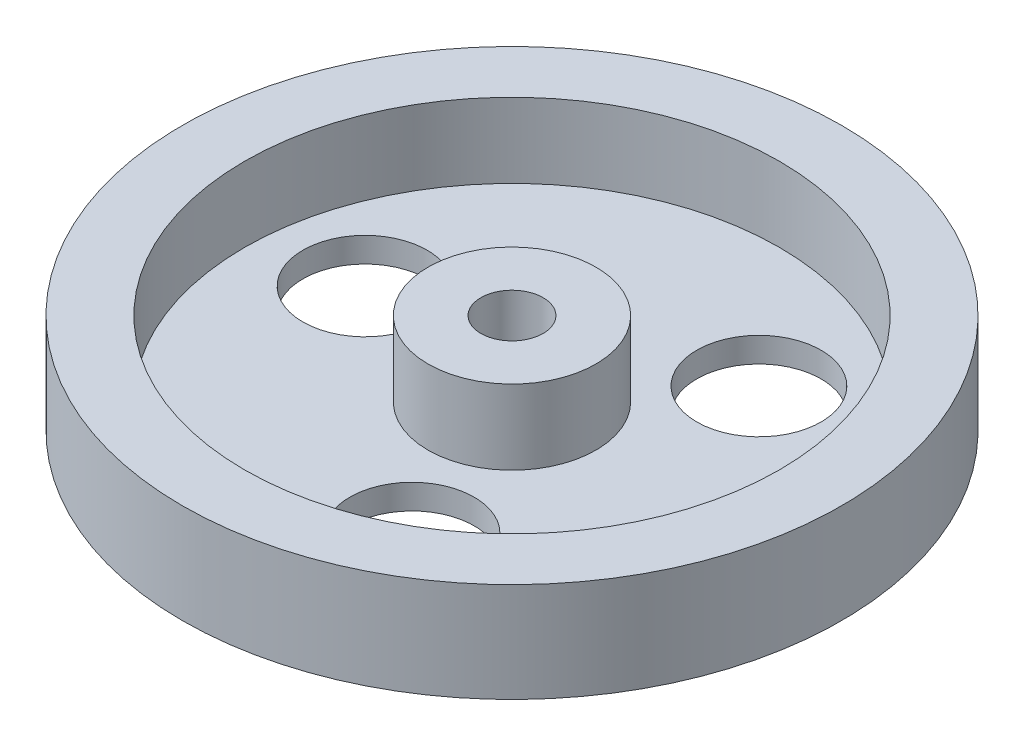
ISO-10303-21;
HEADER;
FILE_DESCRIPTION(('STEP AP214'),'2;1');
FILE_NAME('part.step','',(''),(''),'','','');
FILE_SCHEMA(('AUTOMOTIVE_DESIGN { 1 0 10303 214 1 1 1 1 }'));
ENDSEC;
DATA;
#1=APPLICATION_CONTEXT('core data for automotive mechanical design processes');
#2=APPLICATION_PROTOCOL_DEFINITION('international standard','automotive_design',2000,#1);
#3=PRODUCT_CONTEXT('',#1,'mechanical');
#4=PRODUCT('Part','Part','',(#3));
#5=PRODUCT_RELATED_PRODUCT_CATEGORY('part','',(#4));
#6=PRODUCT_DEFINITION_FORMATION('','',#4);
#7=PRODUCT_DEFINITION_CONTEXT('part definition',#1,'design');
#8=PRODUCT_DEFINITION('design','',#6,#7);
#9=PRODUCT_DEFINITION_SHAPE('','',#8);
#10=(LENGTH_UNIT() NAMED_UNIT(*) SI_UNIT(.MILLI.,.METRE.));
#11=(NAMED_UNIT(*) PLANE_ANGLE_UNIT() SI_UNIT($,.RADIAN.));
#12=(NAMED_UNIT(*) SI_UNIT($,.STERADIAN.) SOLID_ANGLE_UNIT());
#13=UNCERTAINTY_MEASURE_WITH_UNIT(LENGTH_MEASURE(1.E-05),#10,'distance_accuracy_value','');
#14=(GEOMETRIC_REPRESENTATION_CONTEXT(3) GLOBAL_UNCERTAINTY_ASSIGNED_CONTEXT((#13)) GLOBAL_UNIT_ASSIGNED_CONTEXT((#10,
#11,#12)) REPRESENTATION_CONTEXT('',''));
#15=CARTESIAN_POINT('',(0.,0.,0.));
#16=DIRECTION('',(0.,0.,1.));
#17=DIRECTION('',(1.,0.,0.));
#18=AXIS2_PLACEMENT_3D('',#15,#16,#17);
#19=CARTESIAN_POINT('',(0.,8.,0.));
#20=DIRECTION('',(0.,-1.,0.));
#21=DIRECTION('',(0.,0.,-1.));
#22=AXIS2_PLACEMENT_3D('',#19,#20,#21);
#23=CYLINDRICAL_SURFACE('',#22,26.5);
#24=CARTESIAN_POINT('',(0.,8.,0.));
#25=DIRECTION('',(0.,1.,0.));
#26=DIRECTION('',(0.,0.,1.));
#27=AXIS2_PLACEMENT_3D('',#24,#25,#26);
#28=CIRCLE('',#27,26.5);
#29=CARTESIAN_POINT('',(0.,8.,26.5));
#30=VERTEX_POINT('',#29);
#31=EDGE_CURVE('E10',#30,#30,#28,.T.);
#32=ORIENTED_EDGE('',*,*,#31,.F.);
#33=EDGE_LOOP('',(#32));
#34=FACE_BOUND('',#33,.T.);
#35=CARTESIAN_POINT('',(0.,0.,0.));
#36=DIRECTION('',(0.,1.,0.));
#37=DIRECTION('',(0.,0.,1.));
#38=AXIS2_PLACEMENT_3D('',#35,#36,#37);
#39=CIRCLE('',#38,26.5);
#40=CARTESIAN_POINT('',(0.,0.,26.5));
#41=VERTEX_POINT('',#40);
#42=EDGE_CURVE('E35',#41,#41,#39,.T.);
#43=ORIENTED_EDGE('',*,*,#42,.T.);
#44=EDGE_LOOP('',(#43));
#45=FACE_BOUND('',#44,.T.);
#46=ADVANCED_FACE('F32',(#34,#45),#23,.T.);
#47=CARTESIAN_POINT('',(0.,8.,0.));
#48=DIRECTION('',(0.,1.,0.));
#49=DIRECTION('',(0.,0.,1.));
#50=AXIS2_PLACEMENT_3D('',#47,#48,#49);
#51=PLANE('',#50);
#52=CARTESIAN_POINT('',(0.,8.,0.));
#53=DIRECTION('',(0.,1.,0.));
#54=DIRECTION('',(0.,0.,1.));
#55=AXIS2_PLACEMENT_3D('',#52,#53,#54);
#56=CIRCLE('',#55,21.5);
#57=CARTESIAN_POINT('',(0.,8.,21.5));
#58=VERTEX_POINT('',#57);
#59=EDGE_CURVE('E44',#58,#58,#56,.T.);
#60=ORIENTED_EDGE('',*,*,#59,.F.);
#61=EDGE_LOOP('',(#60));
#62=FACE_BOUND('',#61,.T.);
#63=ORIENTED_EDGE('',*,*,#31,.T.);
#64=EDGE_LOOP('',(#63));
#65=FACE_BOUND('',#64,.T.);
#66=ADVANCED_FACE('F109',(#62,#65),#51,.T.);
#67=CARTESIAN_POINT('',(0.,0.,0.));
#68=DIRECTION('',(0.,1.,0.));
#69=DIRECTION('',(0.,0.,1.));
#70=AXIS2_PLACEMENT_3D('',#67,#68,#69);
#71=PLANE('',#70);
#72=CARTESIAN_POINT('',(8.83815804580016,0.,-11.0182842292917));
#73=DIRECTION('',(0.,1.,0.));
#74=DIRECTION('',(0.,0.,1.));
#75=AXIS2_PLACEMENT_3D('',#72,#73,#74);
#76=CIRCLE('',#75,5.);
#77=CARTESIAN_POINT('',(8.83815804580016,0.,-6.01828422929168));
#78=VERTEX_POINT('',#77);
#79=EDGE_CURVE('E71',#78,#78,#76,.T.);
#80=ORIENTED_EDGE('',*,*,#79,.T.);
#81=EDGE_LOOP('',(#80));
#82=FACE_BOUND('',#81,.T.);
#83=CARTESIAN_POINT('',(5.12303502578391,0.,13.1632115049706));
#84=DIRECTION('',(0.,1.,0.));
#85=DIRECTION('',(0.,0.,1.));
#86=AXIS2_PLACEMENT_3D('',#83,#84,#85);
#87=CIRCLE('',#86,5.);
#88=CARTESIAN_POINT('',(5.12303502578391,0.,18.1632115049706));
#89=VERTEX_POINT('',#88);
#90=EDGE_CURVE('E65',#89,#89,#87,.T.);
#91=ORIENTED_EDGE('',*,*,#90,.T.);
#92=EDGE_LOOP('',(#91));
#93=FACE_BOUND('',#92,.T.);
#94=CARTESIAN_POINT('',(-13.9611930715841,0.,-2.14492727567885));
#95=DIRECTION('',(0.,1.,0.));
#96=DIRECTION('',(0.,0.,1.));
#97=AXIS2_PLACEMENT_3D('',#94,#95,#96);
#98=CIRCLE('',#97,5.);
#99=CARTESIAN_POINT('',(-13.9611930715841,0.,2.85507272432115));
#100=VERTEX_POINT('',#99);
#101=EDGE_CURVE('E59',#100,#100,#98,.T.);
#102=ORIENTED_EDGE('',*,*,#101,.T.);
#103=EDGE_LOOP('',(#102));
#104=FACE_BOUND('',#103,.T.);
#105=CARTESIAN_POINT('',(0.,0.,0.));
#106=DIRECTION('',(0.,1.,0.));
#107=DIRECTION('',(0.,0.,1.));
#108=AXIS2_PLACEMENT_3D('',#105,#106,#107);
#109=CIRCLE('',#108,2.5);
#110=CARTESIAN_POINT('',(0.,0.,2.5));
#111=VERTEX_POINT('',#110);
#112=EDGE_CURVE('E53',#111,#111,#109,.T.);
#113=ORIENTED_EDGE('',*,*,#112,.T.);
#114=EDGE_LOOP('',(#113));
#115=FACE_BOUND('',#114,.T.);
#116=ORIENTED_EDGE('',*,*,#42,.F.);
#117=EDGE_LOOP('',(#116));
#118=FACE_BOUND('',#117,.T.);
#119=ADVANCED_FACE('F80',(#82,#93,#104,#115,#118),#71,.F.);
#120=CARTESIAN_POINT('',(0.,2.,0.));
#121=DIRECTION('',(0.,1.,0.));
#122=DIRECTION('',(0.,0.,1.));
#123=AXIS2_PLACEMENT_3D('',#120,#121,#122);
#124=CYLINDRICAL_SURFACE('',#123,21.5);
#125=CARTESIAN_POINT('',(0.,2.,0.));
#126=DIRECTION('',(0.,1.,0.));
#127=DIRECTION('',(0.,0.,1.));
#128=AXIS2_PLACEMENT_3D('',#125,#126,#127);
#129=CIRCLE('',#128,21.5);
#130=CARTESIAN_POINT('',(0.,2.,21.5));
#131=VERTEX_POINT('',#130);
#132=EDGE_CURVE('E42',#131,#131,#129,.T.);
#133=ORIENTED_EDGE('',*,*,#132,.F.);
#134=EDGE_LOOP('',(#133));
#135=FACE_BOUND('',#134,.T.);
#136=ORIENTED_EDGE('',*,*,#59,.T.);
#137=EDGE_LOOP('',(#136));
#138=FACE_BOUND('',#137,.T.);
#139=ADVANCED_FACE('F94',(#135,#138),#124,.F.);
#140=CARTESIAN_POINT('',(0.,2.,0.));
#141=DIRECTION('',(0.,1.,0.));
#142=DIRECTION('',(0.,0.,1.));
#143=AXIS2_PLACEMENT_3D('',#140,#141,#142);
#144=PLANE('',#143);
#145=CARTESIAN_POINT('',(8.83815804580016,2.,-11.0182842292917));
#146=DIRECTION('',(0.,1.,0.));
#147=DIRECTION('',(0.,0.,1.));
#148=AXIS2_PLACEMENT_3D('',#145,#146,#147);
#149=CIRCLE('',#148,5.);
#150=CARTESIAN_POINT('',(8.83815804580016,2.,-6.01828422929168));
#151=VERTEX_POINT('',#150);
#152=EDGE_CURVE('E74',#151,#151,#149,.T.);
#153=ORIENTED_EDGE('',*,*,#152,.F.);
#154=EDGE_LOOP('',(#153));
#155=FACE_BOUND('',#154,.T.);
#156=CARTESIAN_POINT('',(5.12303502578391,2.,13.1632115049706));
#157=DIRECTION('',(0.,1.,0.));
#158=DIRECTION('',(0.,0.,1.));
#159=AXIS2_PLACEMENT_3D('',#156,#157,#158);
#160=CIRCLE('',#159,5.);
#161=CARTESIAN_POINT('',(5.12303502578391,2.,18.1632115049706));
#162=VERTEX_POINT('',#161);
#163=EDGE_CURVE('E68',#162,#162,#160,.T.);
#164=ORIENTED_EDGE('',*,*,#163,.F.);
#165=EDGE_LOOP('',(#164));
#166=FACE_BOUND('',#165,.T.);
#167=CARTESIAN_POINT('',(-13.9611930715841,2.,-2.14492727567885));
#168=DIRECTION('',(0.,1.,0.));
#169=DIRECTION('',(0.,0.,1.));
#170=AXIS2_PLACEMENT_3D('',#167,#168,#169);
#171=CIRCLE('',#170,5.);
#172=CARTESIAN_POINT('',(-13.9611930715841,2.,2.85507272432115));
#173=VERTEX_POINT('',#172);
#174=EDGE_CURVE('E62',#173,#173,#171,.T.);
#175=ORIENTED_EDGE('',*,*,#174,.F.);
#176=EDGE_LOOP('',(#175));
#177=FACE_BOUND('',#176,.T.);
#178=CARTESIAN_POINT('',(0.,2.,0.));
#179=DIRECTION('',(0.,1.,0.));
#180=DIRECTION('',(0.,0.,1.));
#181=AXIS2_PLACEMENT_3D('',#178,#179,#180);
#182=CIRCLE('',#181,6.75);
#183=CARTESIAN_POINT('',(0.,2.,6.75));
#184=VERTEX_POINT('',#183);
#185=EDGE_CURVE('E47',#184,#184,#182,.T.);
#186=ORIENTED_EDGE('',*,*,#185,.F.);
#187=EDGE_LOOP('',(#186));
#188=FACE_BOUND('',#187,.T.);
#189=ORIENTED_EDGE('',*,*,#132,.T.);
#190=EDGE_LOOP('',(#189));
#191=FACE_BOUND('',#190,.T.);
#192=ADVANCED_FACE('F90',(#155,#166,#177,#188,#191),#144,.T.);
#193=CARTESIAN_POINT('',(0.,2.,0.));
#194=DIRECTION('',(0.,1.,0.));
#195=DIRECTION('',(0.,0.,1.));
#196=AXIS2_PLACEMENT_3D('',#193,#194,#195);
#197=CYLINDRICAL_SURFACE('',#196,6.75);
#198=ORIENTED_EDGE('',*,*,#185,.T.);
#199=EDGE_LOOP('',(#198));
#200=FACE_BOUND('',#199,.T.);
#201=CARTESIAN_POINT('',(0.,8.,0.));
#202=DIRECTION('',(0.,1.,0.));
#203=DIRECTION('',(0.,0.,1.));
#204=AXIS2_PLACEMENT_3D('',#201,#202,#203);
#205=CIRCLE('',#204,6.75);
#206=CARTESIAN_POINT('',(0.,8.,6.75));
#207=VERTEX_POINT('',#206);
#208=EDGE_CURVE('E50',#207,#207,#205,.T.);
#209=ORIENTED_EDGE('',*,*,#208,.F.);
#210=EDGE_LOOP('',(#209));
#211=FACE_BOUND('',#210,.T.);
#212=ADVANCED_FACE('F93',(#200,#211),#197,.T.);
#213=CARTESIAN_POINT('',(0.,8.,0.));
#214=DIRECTION('',(0.,1.,0.));
#215=DIRECTION('',(0.,0.,1.));
#216=AXIS2_PLACEMENT_3D('',#213,#214,#215);
#217=CIRCLE('',#216,2.5);
#218=CARTESIAN_POINT('',(0.,8.,2.5));
#219=VERTEX_POINT('',#218);
#220=EDGE_CURVE('E56',#219,#219,#217,.T.);
#221=ORIENTED_EDGE('',*,*,#220,.F.);
#222=EDGE_LOOP('',(#221));
#223=FACE_BOUND('',#222,.T.);
#224=ORIENTED_EDGE('',*,*,#208,.T.);
#225=EDGE_LOOP('',(#224));
#226=FACE_BOUND('',#225,.T.);
#227=ADVANCED_FACE('F112',(#223,#226),#51,.T.);
#228=CARTESIAN_POINT('',(0.,0.,0.));
#229=DIRECTION('',(0.,1.,0.));
#230=DIRECTION('',(0.,0.,1.));
#231=AXIS2_PLACEMENT_3D('',#228,#229,#230);
#232=CYLINDRICAL_SURFACE('',#231,2.5);
#233=ORIENTED_EDGE('',*,*,#112,.F.);
#234=EDGE_LOOP('',(#233));
#235=FACE_BOUND('',#234,.T.);
#236=ORIENTED_EDGE('',*,*,#220,.T.);
#237=EDGE_LOOP('',(#236));
#238=FACE_BOUND('',#237,.T.);
#239=ADVANCED_FACE('F120',(#235,#238),#232,.F.);
#240=CARTESIAN_POINT('',(-13.9611930715841,0.,-2.14492727567885));
#241=DIRECTION('',(0.,1.,0.));
#242=DIRECTION('',(0.,0.,1.));
#243=AXIS2_PLACEMENT_3D('',#240,#241,#242);
#244=CYLINDRICAL_SURFACE('',#243,5.);
#245=ORIENTED_EDGE('',*,*,#101,.F.);
#246=EDGE_LOOP('',(#245));
#247=FACE_BOUND('',#246,.T.);
#248=ORIENTED_EDGE('',*,*,#174,.T.);
#249=EDGE_LOOP('',(#248));
#250=FACE_BOUND('',#249,.T.);
#251=ADVANCED_FACE('F126',(#247,#250),#244,.F.);
#252=CARTESIAN_POINT('',(5.12303502578391,0.,13.1632115049706));
#253=DIRECTION('',(0.,1.,0.));
#254=DIRECTION('',(0.,0.,1.));
#255=AXIS2_PLACEMENT_3D('',#252,#253,#254);
#256=CYLINDRICAL_SURFACE('',#255,5.);
#257=ORIENTED_EDGE('',*,*,#90,.F.);
#258=EDGE_LOOP('',(#257));
#259=FACE_BOUND('',#258,.T.);
#260=ORIENTED_EDGE('',*,*,#163,.T.);
#261=EDGE_LOOP('',(#260));
#262=FACE_BOUND('',#261,.T.);
#263=ADVANCED_FACE('F86',(#259,#262),#256,.F.);
#264=CARTESIAN_POINT('',(8.83815804580016,0.,-11.0182842292917));
#265=DIRECTION('',(0.,1.,0.));
#266=DIRECTION('',(0.,0.,1.));
#267=AXIS2_PLACEMENT_3D('',#264,#265,#266);
#268=CYLINDRICAL_SURFACE('',#267,5.);
#269=ORIENTED_EDGE('',*,*,#79,.F.);
#270=EDGE_LOOP('',(#269));
#271=FACE_BOUND('',#270,.T.);
#272=ORIENTED_EDGE('',*,*,#152,.T.);
#273=EDGE_LOOP('',(#272));
#274=FACE_BOUND('',#273,.T.);
#275=ADVANCED_FACE('F83',(#271,#274),#268,.F.);
#276=CLOSED_SHELL('',(#46,#66,#119,#139,#192,#212,#227,#239,#251,#263,#275));
#277=MANIFOLD_SOLID_BREP('B2',#276);
#278=ADVANCED_BREP_SHAPE_REPRESENTATION('',(#18,#277),#14);
#279=SHAPE_DEFINITION_REPRESENTATION(#9,#278);
ENDSEC;
END-ISO-10303-21;
